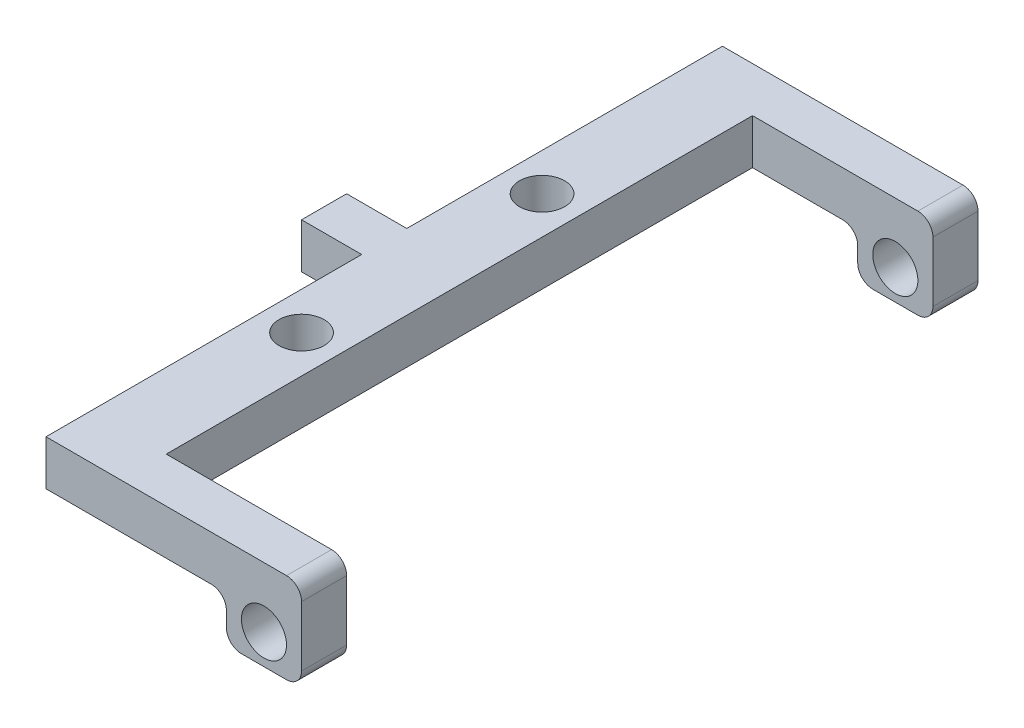
ISO-10303-21;
HEADER;
FILE_DESCRIPTION(('STEP AP214'),'2;1');
FILE_NAME('part.step','',(''),(''),'','','');
FILE_SCHEMA(('AUTOMOTIVE_DESIGN { 1 0 10303 214 1 1 1 1 }'));
ENDSEC;
DATA;
#1=APPLICATION_CONTEXT('core data for automotive mechanical design processes');
#2=APPLICATION_PROTOCOL_DEFINITION('international standard','automotive_design',2000,#1);
#3=PRODUCT_CONTEXT('',#1,'mechanical');
#4=PRODUCT('Part','Part','',(#3));
#5=PRODUCT_RELATED_PRODUCT_CATEGORY('part','',(#4));
#6=PRODUCT_DEFINITION_FORMATION('','',#4);
#7=PRODUCT_DEFINITION_CONTEXT('part definition',#1,'design');
#8=PRODUCT_DEFINITION('design','',#6,#7);
#9=PRODUCT_DEFINITION_SHAPE('','',#8);
#10=(LENGTH_UNIT() NAMED_UNIT(*) SI_UNIT(.MILLI.,.METRE.));
#11=(NAMED_UNIT(*) PLANE_ANGLE_UNIT() SI_UNIT($,.RADIAN.));
#12=(NAMED_UNIT(*) SI_UNIT($,.STERADIAN.) SOLID_ANGLE_UNIT());
#13=UNCERTAINTY_MEASURE_WITH_UNIT(LENGTH_MEASURE(1.E-05),#10,'distance_accuracy_value','');
#14=(GEOMETRIC_REPRESENTATION_CONTEXT(3) GLOBAL_UNCERTAINTY_ASSIGNED_CONTEXT((#13)) GLOBAL_UNIT_ASSIGNED_CONTEXT((#10,
#11,#12)) REPRESENTATION_CONTEXT('',''));
#15=CARTESIAN_POINT('',(0.,0.,0.));
#16=DIRECTION('',(0.,0.,1.));
#17=DIRECTION('',(1.,0.,0.));
#18=AXIS2_PLACEMENT_3D('',#15,#16,#17);
#19=CARTESIAN_POINT('',(0.,3.,0.));
#20=DIRECTION('',(0.,1.,0.));
#21=DIRECTION('',(0.,0.,1.));
#22=AXIS2_PLACEMENT_3D('',#19,#20,#21);
#23=PLANE('',#22);
#24=CARTESIAN_POINT('',(0.,3.,-8.));
#25=DIRECTION('',(0.,1.,0.));
#26=DIRECTION('',(0.,0.,1.));
#27=AXIS2_PLACEMENT_3D('',#24,#25,#26);
#28=CIRCLE('',#27,1.5);
#29=CARTESIAN_POINT('',(0.,3.,-6.5));
#30=VERTEX_POINT('',#29);
#31=EDGE_CURVE('E236',#30,#30,#28,.T.);
#32=ORIENTED_EDGE('',*,*,#31,.F.);
#33=EDGE_LOOP('',(#32));
#34=FACE_BOUND('',#33,.T.);
#35=DIRECTION('',(1.,0.,0.));
#36=VECTOR('',#35,1.);
#37=CARTESIAN_POINT('',(-2.5,3.,22.5));
#38=LINE('',#37,#36);
#39=CARTESIAN_POINT('',(-2.5,3.,22.5));
#40=VERTEX_POINT('',#39);
#41=CARTESIAN_POINT('',(13.5,3.,22.5));
#42=VERTEX_POINT('',#41);
#43=EDGE_CURVE('E292',#40,#42,#38,.T.);
#44=ORIENTED_EDGE('',*,*,#43,.T.);
#45=DIRECTION('',(0.,0.,1.));
#46=VECTOR('',#45,1.);
#47=CARTESIAN_POINT('',(13.5,3.,19.5));
#48=LINE('',#47,#46);
#49=CARTESIAN_POINT('',(13.5,3.,19.5));
#50=VERTEX_POINT('',#49);
#51=EDGE_CURVE('E334',#50,#42,#48,.T.);
#52=ORIENTED_EDGE('',*,*,#51,.F.);
#53=DIRECTION('',(1.,0.,0.));
#54=VECTOR('',#53,1.);
#55=CARTESIAN_POINT('',(2.5,3.,19.5));
#56=LINE('',#55,#54);
#57=CARTESIAN_POINT('',(2.5,3.,19.5));
#58=VERTEX_POINT('',#57);
#59=EDGE_CURVE('E382',#58,#50,#56,.T.);
#60=ORIENTED_EDGE('',*,*,#59,.F.);
#61=DIRECTION('',(0.,0.,-1.));
#62=VECTOR('',#61,1.);
#63=CARTESIAN_POINT('',(2.5,3.,-10.5));
#64=LINE('',#63,#62);
#65=CARTESIAN_POINT('',(2.5,3.,-19.5));
#66=VERTEX_POINT('',#65);
#67=EDGE_CURVE('E55',#58,#66,#64,.T.);
#68=ORIENTED_EDGE('',*,*,#67,.T.);
#69=DIRECTION('',(1.,0.,0.));
#70=VECTOR('',#69,1.);
#71=CARTESIAN_POINT('',(2.5,3.,-19.5));
#72=LINE('',#71,#70);
#73=CARTESIAN_POINT('',(13.5,3.,-19.5));
#74=VERTEX_POINT('',#73);
#75=EDGE_CURVE('E394',#66,#74,#72,.T.);
#76=ORIENTED_EDGE('',*,*,#75,.T.);
#77=DIRECTION('',(0.,0.,-1.));
#78=VECTOR('',#77,1.);
#79=CARTESIAN_POINT('',(13.5,3.,-19.5));
#80=LINE('',#79,#78);
#81=CARTESIAN_POINT('',(13.5,3.,-22.5));
#82=VERTEX_POINT('',#81);
#83=EDGE_CURVE('E428',#74,#82,#80,.T.);
#84=ORIENTED_EDGE('',*,*,#83,.T.);
#85=DIRECTION('',(-1.,0.,0.));
#86=VECTOR('',#85,1.);
#87=CARTESIAN_POINT('',(-2.5,3.,-22.5));
#88=LINE('',#87,#86);
#89=CARTESIAN_POINT('',(-2.5,3.,-22.5));
#90=VERTEX_POINT('',#89);
#91=EDGE_CURVE('E294',#82,#90,#88,.T.);
#92=ORIENTED_EDGE('',*,*,#91,.T.);
#93=DIRECTION('',(0.,0.,1.));
#94=VECTOR('',#93,1.);
#95=CARTESIAN_POINT('',(-2.5,3.,-10.5));
#96=LINE('',#95,#94);
#97=CARTESIAN_POINT('',(-2.5,3.,-1.50000000000001));
#98=VERTEX_POINT('',#97);
#99=EDGE_CURVE('E91',#90,#98,#96,.T.);
#100=ORIENTED_EDGE('',*,*,#99,.T.);
#101=DIRECTION('',(-1.,0.,0.));
#102=VECTOR('',#101,1.);
#103=CARTESIAN_POINT('',(-6.5,3.,-1.5));
#104=LINE('',#103,#102);
#105=CARTESIAN_POINT('',(-6.5,3.,-1.5));
#106=VERTEX_POINT('',#105);
#107=EDGE_CURVE('E325',#98,#106,#104,.T.);
#108=ORIENTED_EDGE('',*,*,#107,.T.);
#109=DIRECTION('',(0.,0.,1.));
#110=VECTOR('',#109,1.);
#111=CARTESIAN_POINT('',(-6.5,3.,-1.5));
#112=LINE('',#111,#110);
#113=CARTESIAN_POINT('',(-6.5,3.,1.5));
#114=VERTEX_POINT('',#113);
#115=EDGE_CURVE('E272',#106,#114,#112,.T.);
#116=ORIENTED_EDGE('',*,*,#115,.T.);
#117=DIRECTION('',(1.,0.,0.));
#118=VECTOR('',#117,1.);
#119=CARTESIAN_POINT('',(-6.5,3.,1.5));
#120=LINE('',#119,#118);
#121=CARTESIAN_POINT('',(-2.5,3.,1.5));
#122=VERTEX_POINT('',#121);
#123=EDGE_CURVE('E63',#114,#122,#120,.T.);
#124=ORIENTED_EDGE('',*,*,#123,.T.);
#125=DIRECTION('',(0.,0.,1.));
#126=VECTOR('',#125,1.);
#127=CARTESIAN_POINT('',(-2.5,3.,1.5));
#128=LINE('',#127,#126);
#129=EDGE_CURVE('E246',#122,#40,#128,.T.);
#130=ORIENTED_EDGE('',*,*,#129,.T.);
#131=EDGE_LOOP('',(#44,#52,#60,#68,#76,#84,#92,#100,#108,#116,#124,#130));
#132=FACE_BOUND('',#131,.T.);
#133=CARTESIAN_POINT('',(0.,3.,8.));
#134=DIRECTION('',(0.,1.,0.));
#135=DIRECTION('',(0.,0.,1.));
#136=AXIS2_PLACEMENT_3D('',#133,#134,#135);
#137=CIRCLE('',#136,1.5);
#138=CARTESIAN_POINT('',(0.,3.,9.5));
#139=VERTEX_POINT('',#138);
#140=EDGE_CURVE('E311',#139,#139,#137,.T.);
#141=ORIENTED_EDGE('',*,*,#140,.F.);
#142=EDGE_LOOP('',(#141));
#143=FACE_BOUND('',#142,.T.);
#144=ADVANCED_FACE('F39',(#34,#132,#143),#23,.T.);
#145=CARTESIAN_POINT('',(0.,0.,0.));
#146=DIRECTION('',(0.,1.,0.));
#147=DIRECTION('',(0.,0.,1.));
#148=AXIS2_PLACEMENT_3D('',#145,#146,#147);
#149=PLANE('',#148);
#150=DIRECTION('',(0.,0.,-1.));
#151=VECTOR('',#150,1.);
#152=CARTESIAN_POINT('',(2.5,0.,-10.5));
#153=LINE('',#152,#151);
#154=CARTESIAN_POINT('',(2.5,0.,19.5));
#155=VERTEX_POINT('',#154);
#156=CARTESIAN_POINT('',(2.5,0.,-19.5));
#157=VERTEX_POINT('',#156);
#158=EDGE_CURVE('E224',#155,#157,#153,.T.);
#159=ORIENTED_EDGE('',*,*,#158,.F.);
#160=DIRECTION('',(-1.,0.,0.));
#161=VECTOR('',#160,1.);
#162=CARTESIAN_POINT('',(8.5,0.,19.5));
#163=LINE('',#162,#161);
#164=CARTESIAN_POINT('',(8.5,0.,19.5));
#165=VERTEX_POINT('',#164);
#166=EDGE_CURVE('E209',#165,#155,#163,.T.);
#167=ORIENTED_EDGE('',*,*,#166,.F.);
#168=DIRECTION('',(0.,0.,1.));
#169=VECTOR('',#168,1.);
#170=CARTESIAN_POINT('',(8.5,0.,19.5));
#171=LINE('',#170,#169);
#172=CARTESIAN_POINT('',(8.5,0.,22.5));
#173=VERTEX_POINT('',#172);
#174=EDGE_CURVE('E379',#165,#173,#171,.T.);
#175=ORIENTED_EDGE('',*,*,#174,.T.);
#176=DIRECTION('',(1.,0.,0.));
#177=VECTOR('',#176,1.);
#178=CARTESIAN_POINT('',(-2.5,0.,22.5));
#179=LINE('',#178,#177);
#180=CARTESIAN_POINT('',(-2.5,0.,22.5));
#181=VERTEX_POINT('',#180);
#182=EDGE_CURVE('E278',#181,#173,#179,.T.);
#183=ORIENTED_EDGE('',*,*,#182,.F.);
#184=DIRECTION('',(0.,0.,1.));
#185=VECTOR('',#184,1.);
#186=CARTESIAN_POINT('',(-2.5,0.,1.5));
#187=LINE('',#186,#185);
#188=CARTESIAN_POINT('',(-2.5,0.,1.5));
#189=VERTEX_POINT('',#188);
#190=EDGE_CURVE('E256',#189,#181,#187,.T.);
#191=ORIENTED_EDGE('',*,*,#190,.F.);
#192=DIRECTION('',(1.,0.,0.));
#193=VECTOR('',#192,1.);
#194=CARTESIAN_POINT('',(-6.5,0.,1.5));
#195=LINE('',#194,#193);
#196=CARTESIAN_POINT('',(-6.5,0.,1.5));
#197=VERTEX_POINT('',#196);
#198=EDGE_CURVE('E84',#197,#189,#195,.T.);
#199=ORIENTED_EDGE('',*,*,#198,.F.);
#200=DIRECTION('',(0.,0.,1.));
#201=VECTOR('',#200,1.);
#202=CARTESIAN_POINT('',(-6.5,0.,-1.5));
#203=LINE('',#202,#201);
#204=CARTESIAN_POINT('',(-6.5,0.,-1.5));
#205=VERTEX_POINT('',#204);
#206=EDGE_CURVE('E251',#205,#197,#203,.T.);
#207=ORIENTED_EDGE('',*,*,#206,.F.);
#208=DIRECTION('',(-1.,0.,0.));
#209=VECTOR('',#208,1.);
#210=CARTESIAN_POINT('',(-6.5,0.,-1.5));
#211=LINE('',#210,#209);
#212=CARTESIAN_POINT('',(-2.5,0.,-1.50000000000001));
#213=VERTEX_POINT('',#212);
#214=EDGE_CURVE('E240',#213,#205,#211,.T.);
#215=ORIENTED_EDGE('',*,*,#214,.F.);
#216=DIRECTION('',(0.,0.,1.));
#217=VECTOR('',#216,1.);
#218=CARTESIAN_POINT('',(-2.5,0.,-10.5));
#219=LINE('',#218,#217);
#220=CARTESIAN_POINT('',(-2.5,0.,-22.5));
#221=VERTEX_POINT('',#220);
#222=EDGE_CURVE('E235',#221,#213,#219,.T.);
#223=ORIENTED_EDGE('',*,*,#222,.F.);
#224=DIRECTION('',(-1.,0.,0.));
#225=VECTOR('',#224,1.);
#226=CARTESIAN_POINT('',(-2.5,0.,-22.5));
#227=LINE('',#226,#225);
#228=CARTESIAN_POINT('',(8.5,0.,-22.5));
#229=VERTEX_POINT('',#228);
#230=EDGE_CURVE('E298',#229,#221,#227,.T.);
#231=ORIENTED_EDGE('',*,*,#230,.F.);
#232=DIRECTION('',(0.,0.,-1.));
#233=VECTOR('',#232,1.);
#234=CARTESIAN_POINT('',(8.5,0.,-19.5));
#235=LINE('',#234,#233);
#236=CARTESIAN_POINT('',(8.5,0.,-19.5));
#237=VERTEX_POINT('',#236);
#238=EDGE_CURVE('E337',#237,#229,#235,.T.);
#239=ORIENTED_EDGE('',*,*,#238,.F.);
#240=DIRECTION('',(-1.,0.,0.));
#241=VECTOR('',#240,1.);
#242=CARTESIAN_POINT('',(8.5,0.,-19.5));
#243=LINE('',#242,#241);
#244=EDGE_CURVE('E233',#237,#157,#243,.T.);
#245=ORIENTED_EDGE('',*,*,#244,.T.);
#246=EDGE_LOOP('',(#159,#167,#175,#183,#191,#199,#207,#215,#223,#231,#239,#245));
#247=FACE_BOUND('',#246,.T.);
#248=CARTESIAN_POINT('',(0.,0.,-8.));
#249=DIRECTION('',(0.,1.,0.));
#250=DIRECTION('',(0.,0.,1.));
#251=AXIS2_PLACEMENT_3D('',#248,#249,#250);
#252=CIRCLE('',#251,1.5);
#253=CARTESIAN_POINT('',(0.,0.,-6.5));
#254=VERTEX_POINT('',#253);
#255=EDGE_CURVE('E243',#254,#254,#252,.T.);
#256=ORIENTED_EDGE('',*,*,#255,.T.);
#257=EDGE_LOOP('',(#256));
#258=FACE_BOUND('',#257,.T.);
#259=CARTESIAN_POINT('',(0.,0.,8.));
#260=DIRECTION('',(0.,1.,0.));
#261=DIRECTION('',(0.,0.,1.));
#262=AXIS2_PLACEMENT_3D('',#259,#260,#261);
#263=CIRCLE('',#262,1.5);
#264=CARTESIAN_POINT('',(0.,0.,9.5));
#265=VERTEX_POINT('',#264);
#266=EDGE_CURVE('E310',#265,#265,#263,.T.);
#267=ORIENTED_EDGE('',*,*,#266,.T.);
#268=EDGE_LOOP('',(#267));
#269=FACE_BOUND('',#268,.T.);
#270=ADVANCED_FACE('F230',(#247,#258,#269),#149,.F.);
#271=CARTESIAN_POINT('',(2.5,3.,-10.5));
#272=DIRECTION('',(-1.,0.,0.));
#273=DIRECTION('',(0.,0.,1.));
#274=AXIS2_PLACEMENT_3D('',#271,#272,#273);
#275=PLANE('',#274);
#276=ORIENTED_EDGE('',*,*,#67,.F.);
#277=DIRECTION('',(0.,1.,0.));
#278=VECTOR('',#277,1.);
#279=CARTESIAN_POINT('',(2.5,3.,19.5));
#280=LINE('',#279,#278);
#281=EDGE_CURVE('E213',#155,#58,#280,.T.);
#282=ORIENTED_EDGE('',*,*,#281,.F.);
#283=ORIENTED_EDGE('',*,*,#158,.T.);
#284=DIRECTION('',(0.,1.,0.));
#285=VECTOR('',#284,1.);
#286=CARTESIAN_POINT('',(2.5,3.,-19.5));
#287=LINE('',#286,#285);
#288=EDGE_CURVE('E391',#157,#66,#287,.T.);
#289=ORIENTED_EDGE('',*,*,#288,.T.);
#290=EDGE_LOOP('',(#276,#282,#283,#289));
#291=FACE_BOUND('',#290,.T.);
#292=ADVANCED_FACE('F41',(#291),#275,.F.);
#293=CARTESIAN_POINT('',(-2.5,3.,-10.5));
#294=DIRECTION('',(1.,0.,0.));
#295=DIRECTION('',(0.,0.,-1.));
#296=AXIS2_PLACEMENT_3D('',#293,#294,#295);
#297=PLANE('',#296);
#298=ORIENTED_EDGE('',*,*,#222,.T.);
#299=DIRECTION('',(0.,-1.,0.));
#300=VECTOR('',#299,1.);
#301=CARTESIAN_POINT('',(-2.5,3.,-1.50000000000001));
#302=LINE('',#301,#300);
#303=EDGE_CURVE('E11',#98,#213,#302,.T.);
#304=ORIENTED_EDGE('',*,*,#303,.F.);
#305=ORIENTED_EDGE('',*,*,#99,.F.);
#306=DIRECTION('',(0.,1.,0.));
#307=VECTOR('',#306,1.);
#308=CARTESIAN_POINT('',(-2.5,0.,-22.5));
#309=LINE('',#308,#307);
#310=EDGE_CURVE('E305',#221,#90,#309,.T.);
#311=ORIENTED_EDGE('',*,*,#310,.F.);
#312=EDGE_LOOP('',(#298,#304,#305,#311));
#313=FACE_BOUND('',#312,.T.);
#314=ADVANCED_FACE('F488',(#313),#297,.F.);
#315=CARTESIAN_POINT('',(-6.5,3.,-1.5));
#316=DIRECTION('',(0.,0.,1.));
#317=DIRECTION('',(1.,0.,0.));
#318=AXIS2_PLACEMENT_3D('',#315,#316,#317);
#319=PLANE('',#318);
#320=ORIENTED_EDGE('',*,*,#214,.T.);
#321=DIRECTION('',(0.,-1.,0.));
#322=VECTOR('',#321,1.);
#323=CARTESIAN_POINT('',(-6.5,3.,-1.5));
#324=LINE('',#323,#322);
#325=EDGE_CURVE('E48',#106,#205,#324,.T.);
#326=ORIENTED_EDGE('',*,*,#325,.F.);
#327=ORIENTED_EDGE('',*,*,#107,.F.);
#328=ORIENTED_EDGE('',*,*,#303,.T.);
#329=EDGE_LOOP('',(#320,#326,#327,#328));
#330=FACE_BOUND('',#329,.T.);
#331=ADVANCED_FACE('F489',(#330),#319,.F.);
#332=CARTESIAN_POINT('',(-6.5,3.,-1.5));
#333=DIRECTION('',(1.,0.,0.));
#334=DIRECTION('',(0.,0.,-1.));
#335=AXIS2_PLACEMENT_3D('',#332,#333,#334);
#336=PLANE('',#335);
#337=ORIENTED_EDGE('',*,*,#206,.T.);
#338=DIRECTION('',(0.,-1.,0.));
#339=VECTOR('',#338,1.);
#340=CARTESIAN_POINT('',(-6.5,3.,1.5));
#341=LINE('',#340,#339);
#342=EDGE_CURVE('E262',#114,#197,#341,.T.);
#343=ORIENTED_EDGE('',*,*,#342,.F.);
#344=ORIENTED_EDGE('',*,*,#115,.F.);
#345=ORIENTED_EDGE('',*,*,#325,.T.);
#346=EDGE_LOOP('',(#337,#343,#344,#345));
#347=FACE_BOUND('',#346,.T.);
#348=ADVANCED_FACE('F270',(#347),#336,.F.);
#349=CARTESIAN_POINT('',(-6.5,3.,1.5));
#350=DIRECTION('',(0.,0.,-1.));
#351=DIRECTION('',(-1.,0.,0.));
#352=AXIS2_PLACEMENT_3D('',#349,#350,#351);
#353=PLANE('',#352);
#354=ORIENTED_EDGE('',*,*,#198,.T.);
#355=DIRECTION('',(0.,-1.,0.));
#356=VECTOR('',#355,1.);
#357=CARTESIAN_POINT('',(-2.5,3.,1.5));
#358=LINE('',#357,#356);
#359=EDGE_CURVE('E259',#122,#189,#358,.T.);
#360=ORIENTED_EDGE('',*,*,#359,.F.);
#361=ORIENTED_EDGE('',*,*,#123,.F.);
#362=ORIENTED_EDGE('',*,*,#342,.T.);
#363=EDGE_LOOP('',(#354,#360,#361,#362));
#364=FACE_BOUND('',#363,.T.);
#365=ADVANCED_FACE('F490',(#364),#353,.F.);
#366=CARTESIAN_POINT('',(-2.5,3.,1.5));
#367=DIRECTION('',(1.,0.,0.));
#368=DIRECTION('',(0.,0.,-1.));
#369=AXIS2_PLACEMENT_3D('',#366,#367,#368);
#370=PLANE('',#369);
#371=ORIENTED_EDGE('',*,*,#190,.T.);
#372=DIRECTION('',(0.,1.,0.));
#373=VECTOR('',#372,1.);
#374=CARTESIAN_POINT('',(-2.5,0.,22.5));
#375=LINE('',#374,#373);
#376=EDGE_CURVE('E284',#181,#40,#375,.T.);
#377=ORIENTED_EDGE('',*,*,#376,.T.);
#378=ORIENTED_EDGE('',*,*,#129,.F.);
#379=ORIENTED_EDGE('',*,*,#359,.T.);
#380=EDGE_LOOP('',(#371,#377,#378,#379));
#381=FACE_BOUND('',#380,.T.);
#382=ADVANCED_FACE('F282',(#381),#370,.F.);
#383=CARTESIAN_POINT('',(0.,3.,-8.));
#384=DIRECTION('',(0.,-1.,0.));
#385=DIRECTION('',(0.,0.,-1.));
#386=AXIS2_PLACEMENT_3D('',#383,#384,#385);
#387=CYLINDRICAL_SURFACE('',#386,1.5);
#388=ORIENTED_EDGE('',*,*,#31,.T.);
#389=EDGE_LOOP('',(#388));
#390=FACE_BOUND('',#389,.T.);
#391=ORIENTED_EDGE('',*,*,#255,.F.);
#392=EDGE_LOOP('',(#391));
#393=FACE_BOUND('',#392,.T.);
#394=ADVANCED_FACE('F497',(#390,#393),#387,.F.);
#395=CARTESIAN_POINT('',(0.,3.,8.));
#396=DIRECTION('',(0.,-1.,0.));
#397=DIRECTION('',(0.,0.,-1.));
#398=AXIS2_PLACEMENT_3D('',#395,#396,#397);
#399=CYLINDRICAL_SURFACE('',#398,1.5);
#400=ORIENTED_EDGE('',*,*,#140,.T.);
#401=EDGE_LOOP('',(#400));
#402=FACE_BOUND('',#401,.T.);
#403=ORIENTED_EDGE('',*,*,#266,.F.);
#404=EDGE_LOOP('',(#403));
#405=FACE_BOUND('',#404,.T.);
#406=ADVANCED_FACE('F511',(#402,#405),#399,.F.);
#407=CARTESIAN_POINT('',(-2.5,0.,-22.5));
#408=DIRECTION('',(0.,0.,-1.));
#409=DIRECTION('',(-1.,0.,0.));
#410=AXIS2_PLACEMENT_3D('',#407,#408,#409);
#411=PLANE('',#410);
#412=ORIENTED_EDGE('',*,*,#91,.F.);
#413=CARTESIAN_POINT('',(13.5,2.,-22.5));
#414=DIRECTION('',(0.,0.,-1.));
#415=DIRECTION('',(-1.,0.,0.));
#416=AXIS2_PLACEMENT_3D('',#413,#414,#415);
#417=CIRCLE('',#416,1.);
#418=CARTESIAN_POINT('',(14.5,2.,-22.5));
#419=VERTEX_POINT('',#418);
#420=EDGE_CURVE('E387',#82,#419,#417,.T.);
#421=ORIENTED_EDGE('',*,*,#420,.T.);
#422=DIRECTION('',(0.,-1.,0.));
#423=VECTOR('',#422,1.);
#424=CARTESIAN_POINT('',(14.5,2.,-22.5));
#425=LINE('',#424,#423);
#426=CARTESIAN_POINT('',(14.5,-2.,-22.5));
#427=VERTEX_POINT('',#426);
#428=EDGE_CURVE('E432',#419,#427,#425,.T.);
#429=ORIENTED_EDGE('',*,*,#428,.T.);
#430=CARTESIAN_POINT('',(13.5,-2.,-22.5));
#431=DIRECTION('',(0.,0.,-1.));
#432=DIRECTION('',(1.,0.,0.));
#433=AXIS2_PLACEMENT_3D('',#430,#431,#432);
#434=CIRCLE('',#433,1.);
#435=CARTESIAN_POINT('',(13.5,-3.,-22.5));
#436=VERTEX_POINT('',#435);
#437=EDGE_CURVE('E436',#427,#436,#434,.T.);
#438=ORIENTED_EDGE('',*,*,#437,.T.);
#439=DIRECTION('',(-1.,0.,0.));
#440=VECTOR('',#439,1.);
#441=CARTESIAN_POINT('',(13.5,-3.,-22.5));
#442=LINE('',#441,#440);
#443=CARTESIAN_POINT('',(10.5,-3.,-22.5));
#444=VERTEX_POINT('',#443);
#445=EDGE_CURVE('E440',#436,#444,#442,.T.);
#446=ORIENTED_EDGE('',*,*,#445,.T.);
#447=CARTESIAN_POINT('',(10.5,-2.,-22.5));
#448=DIRECTION('',(0.,0.,-1.));
#449=DIRECTION('',(-1.,0.,0.));
#450=AXIS2_PLACEMENT_3D('',#447,#448,#449);
#451=CIRCLE('',#450,1.);
#452=CARTESIAN_POINT('',(9.5,-2.,-22.5));
#453=VERTEX_POINT('',#452);
#454=EDGE_CURVE('E444',#444,#453,#451,.T.);
#455=ORIENTED_EDGE('',*,*,#454,.T.);
#456=DIRECTION('',(0.,1.,0.));
#457=VECTOR('',#456,1.);
#458=CARTESIAN_POINT('',(9.5,-2.,-22.5));
#459=LINE('',#458,#457);
#460=CARTESIAN_POINT('',(9.5,-1.,-22.5));
#461=VERTEX_POINT('',#460);
#462=EDGE_CURVE('E448',#453,#461,#459,.T.);
#463=ORIENTED_EDGE('',*,*,#462,.T.);
#464=CARTESIAN_POINT('',(8.5,-1.,-22.5));
#465=DIRECTION('',(0.,0.,1.));
#466=DIRECTION('',(1.,0.,0.));
#467=AXIS2_PLACEMENT_3D('',#464,#465,#466);
#468=CIRCLE('',#467,1.);
#469=EDGE_CURVE('E395',#461,#229,#468,.T.);
#470=ORIENTED_EDGE('',*,*,#469,.T.);
#471=ORIENTED_EDGE('',*,*,#230,.T.);
#472=ORIENTED_EDGE('',*,*,#310,.T.);
#473=EDGE_LOOP('',(#412,#421,#429,#438,#446,#455,#463,#470,#471,#472));
#474=FACE_BOUND('',#473,.T.);
#475=CARTESIAN_POINT('',(12.,-1.,-22.5));
#476=DIRECTION('',(0.,0.,-1.));
#477=DIRECTION('',(-1.,0.,0.));
#478=AXIS2_PLACEMENT_3D('',#475,#476,#477);
#479=CIRCLE('',#478,1.5);
#480=CARTESIAN_POINT('',(10.5,-1.,-22.5));
#481=VERTEX_POINT('',#480);
#482=EDGE_CURVE('E344',#481,#481,#479,.T.);
#483=ORIENTED_EDGE('',*,*,#482,.F.);
#484=EDGE_LOOP('',(#483));
#485=FACE_BOUND('',#484,.T.);
#486=ADVANCED_FACE('F484',(#474,#485),#411,.T.);
#487=CARTESIAN_POINT('',(-2.5,0.,22.5));
#488=DIRECTION('',(0.,0.,1.));
#489=DIRECTION('',(1.,0.,0.));
#490=AXIS2_PLACEMENT_3D('',#487,#488,#489);
#491=PLANE('',#490);
#492=ORIENTED_EDGE('',*,*,#43,.F.);
#493=ORIENTED_EDGE('',*,*,#376,.F.);
#494=ORIENTED_EDGE('',*,*,#182,.T.);
#495=CARTESIAN_POINT('',(8.5,-1.,22.5));
#496=DIRECTION('',(0.,0.,1.));
#497=DIRECTION('',(1.,0.,0.));
#498=AXIS2_PLACEMENT_3D('',#495,#496,#497);
#499=CIRCLE('',#498,1.);
#500=CARTESIAN_POINT('',(9.5,-1.,22.5));
#501=VERTEX_POINT('',#500);
#502=EDGE_CURVE('E597',#501,#173,#499,.T.);
#503=ORIENTED_EDGE('',*,*,#502,.F.);
#504=DIRECTION('',(0.,1.,0.));
#505=VECTOR('',#504,1.);
#506=CARTESIAN_POINT('',(9.5,-2.,22.5));
#507=LINE('',#506,#505);
#508=CARTESIAN_POINT('',(9.5,-2.,22.5));
#509=VERTEX_POINT('',#508);
#510=EDGE_CURVE('E623',#509,#501,#507,.T.);
#511=ORIENTED_EDGE('',*,*,#510,.F.);
#512=CARTESIAN_POINT('',(10.5,-2.,22.5));
#513=DIRECTION('',(0.,0.,-1.));
#514=DIRECTION('',(-1.,0.,0.));
#515=AXIS2_PLACEMENT_3D('',#512,#513,#514);
#516=CIRCLE('',#515,1.);
#517=CARTESIAN_POINT('',(10.5,-3.,22.5));
#518=VERTEX_POINT('',#517);
#519=EDGE_CURVE('E626',#518,#509,#516,.T.);
#520=ORIENTED_EDGE('',*,*,#519,.F.);
#521=DIRECTION('',(-1.,0.,0.));
#522=VECTOR('',#521,1.);
#523=CARTESIAN_POINT('',(13.5,-3.,22.5));
#524=LINE('',#523,#522);
#525=CARTESIAN_POINT('',(13.5,-3.,22.5));
#526=VERTEX_POINT('',#525);
#527=EDGE_CURVE('E629',#526,#518,#524,.T.);
#528=ORIENTED_EDGE('',*,*,#527,.F.);
#529=CARTESIAN_POINT('',(13.5,-2.,22.5));
#530=DIRECTION('',(0.,0.,-1.));
#531=DIRECTION('',(1.,0.,0.));
#532=AXIS2_PLACEMENT_3D('',#529,#530,#531);
#533=CIRCLE('',#532,1.);
#534=CARTESIAN_POINT('',(14.5,-2.,22.5));
#535=VERTEX_POINT('',#534);
#536=EDGE_CURVE('E353',#535,#526,#533,.T.);
#537=ORIENTED_EDGE('',*,*,#536,.F.);
#538=DIRECTION('',(0.,-1.,0.));
#539=VECTOR('',#538,1.);
#540=CARTESIAN_POINT('',(14.5,2.,22.5));
#541=LINE('',#540,#539);
#542=CARTESIAN_POINT('',(14.5,2.,22.5));
#543=VERTEX_POINT('',#542);
#544=EDGE_CURVE('E349',#543,#535,#541,.T.);
#545=ORIENTED_EDGE('',*,*,#544,.F.);
#546=CARTESIAN_POINT('',(13.5,2.,22.5));
#547=DIRECTION('',(0.,0.,-1.));
#548=DIRECTION('',(-1.,0.,0.));
#549=AXIS2_PLACEMENT_3D('',#546,#547,#548);
#550=CIRCLE('',#549,1.);
#551=EDGE_CURVE('E227',#42,#543,#550,.T.);
#552=ORIENTED_EDGE('',*,*,#551,.F.);
#553=EDGE_LOOP('',(#492,#493,#494,#503,#511,#520,#528,#537,#545,#552));
#554=FACE_BOUND('',#553,.T.);
#555=CARTESIAN_POINT('',(12.,-1.,22.5));
#556=DIRECTION('',(0.,0.,-1.));
#557=DIRECTION('',(-1.,0.,0.));
#558=AXIS2_PLACEMENT_3D('',#555,#556,#557);
#559=CIRCLE('',#558,1.5);
#560=CARTESIAN_POINT('',(10.5,-1.,22.5));
#561=VERTEX_POINT('',#560);
#562=EDGE_CURVE('E593',#561,#561,#559,.T.);
#563=ORIENTED_EDGE('',*,*,#562,.T.);
#564=EDGE_LOOP('',(#563));
#565=FACE_BOUND('',#564,.T.);
#566=ADVANCED_FACE('F287',(#554,#565),#491,.T.);
#567=CARTESIAN_POINT('',(8.5,-1.,-19.5));
#568=DIRECTION('',(0.,0.,-1.));
#569=DIRECTION('',(-1.,0.,0.));
#570=AXIS2_PLACEMENT_3D('',#567,#568,#569);
#571=CYLINDRICAL_SURFACE('',#570,1.);
#572=ORIENTED_EDGE('',*,*,#469,.F.);
#573=DIRECTION('',(0.,0.,-1.));
#574=VECTOR('',#573,1.);
#575=CARTESIAN_POINT('',(9.5,-1.,-19.5));
#576=LINE('',#575,#574);
#577=CARTESIAN_POINT('',(9.5,-1.,-19.5));
#578=VERTEX_POINT('',#577);
#579=EDGE_CURVE('E458',#578,#461,#576,.T.);
#580=ORIENTED_EDGE('',*,*,#579,.F.);
#581=CARTESIAN_POINT('',(8.5,-1.,-19.5));
#582=DIRECTION('',(0.,0.,1.));
#583=DIRECTION('',(1.,0.,0.));
#584=AXIS2_PLACEMENT_3D('',#581,#582,#583);
#585=CIRCLE('',#584,1.);
#586=EDGE_CURVE('E422',#578,#237,#585,.T.);
#587=ORIENTED_EDGE('',*,*,#586,.T.);
#588=ORIENTED_EDGE('',*,*,#238,.T.);
#589=EDGE_LOOP('',(#572,#580,#587,#588));
#590=FACE_BOUND('',#589,.T.);
#591=ADVANCED_FACE('F520',(#590),#571,.F.);
#592=CARTESIAN_POINT('',(9.5,-2.,-19.5));
#593=DIRECTION('',(-1.,0.,0.));
#594=DIRECTION('',(0.,0.,1.));
#595=AXIS2_PLACEMENT_3D('',#592,#593,#594);
#596=PLANE('',#595);
#597=ORIENTED_EDGE('',*,*,#462,.F.);
#598=DIRECTION('',(0.,0.,-1.));
#599=VECTOR('',#598,1.);
#600=CARTESIAN_POINT('',(9.5,-2.,-19.5));
#601=LINE('',#600,#599);
#602=CARTESIAN_POINT('',(9.5,-2.,-19.5));
#603=VERTEX_POINT('',#602);
#604=EDGE_CURVE('E461',#603,#453,#601,.T.);
#605=ORIENTED_EDGE('',*,*,#604,.F.);
#606=DIRECTION('',(0.,1.,0.));
#607=VECTOR('',#606,1.);
#608=CARTESIAN_POINT('',(9.5,-2.,-19.5));
#609=LINE('',#608,#607);
#610=EDGE_CURVE('E418',#603,#578,#609,.T.);
#611=ORIENTED_EDGE('',*,*,#610,.T.);
#612=ORIENTED_EDGE('',*,*,#579,.T.);
#613=EDGE_LOOP('',(#597,#605,#611,#612));
#614=FACE_BOUND('',#613,.T.);
#615=ADVANCED_FACE('F539',(#614),#596,.T.);
#616=CARTESIAN_POINT('',(10.5,-2.,-19.5));
#617=DIRECTION('',(0.,0.,-1.));
#618=DIRECTION('',(-1.,0.,0.));
#619=AXIS2_PLACEMENT_3D('',#616,#617,#618);
#620=CYLINDRICAL_SURFACE('',#619,1.);
#621=ORIENTED_EDGE('',*,*,#454,.F.);
#622=DIRECTION('',(0.,0.,-1.));
#623=VECTOR('',#622,1.);
#624=CARTESIAN_POINT('',(10.5,-3.,-19.5));
#625=LINE('',#624,#623);
#626=CARTESIAN_POINT('',(10.5,-3.,-19.5));
#627=VERTEX_POINT('',#626);
#628=EDGE_CURVE('E464',#627,#444,#625,.T.);
#629=ORIENTED_EDGE('',*,*,#628,.F.);
#630=CARTESIAN_POINT('',(10.5,-2.,-19.5));
#631=DIRECTION('',(0.,0.,-1.));
#632=DIRECTION('',(-1.,0.,0.));
#633=AXIS2_PLACEMENT_3D('',#630,#631,#632);
#634=CIRCLE('',#633,1.);
#635=EDGE_CURVE('E414',#627,#603,#634,.T.);
#636=ORIENTED_EDGE('',*,*,#635,.T.);
#637=ORIENTED_EDGE('',*,*,#604,.T.);
#638=EDGE_LOOP('',(#621,#629,#636,#637));
#639=FACE_BOUND('',#638,.T.);
#640=ADVANCED_FACE('F535',(#639),#620,.T.);
#641=CARTESIAN_POINT('',(13.5,-3.,-19.5));
#642=DIRECTION('',(0.,-1.,0.));
#643=DIRECTION('',(0.,0.,-1.));
#644=AXIS2_PLACEMENT_3D('',#641,#642,#643);
#645=PLANE('',#644);
#646=ORIENTED_EDGE('',*,*,#445,.F.);
#647=DIRECTION('',(0.,0.,-1.));
#648=VECTOR('',#647,1.);
#649=CARTESIAN_POINT('',(13.5,-3.,-19.5));
#650=LINE('',#649,#648);
#651=CARTESIAN_POINT('',(13.5,-3.,-19.5));
#652=VERTEX_POINT('',#651);
#653=EDGE_CURVE('E467',#652,#436,#650,.T.);
#654=ORIENTED_EDGE('',*,*,#653,.F.);
#655=DIRECTION('',(-1.,0.,0.));
#656=VECTOR('',#655,1.);
#657=CARTESIAN_POINT('',(13.5,-3.,-19.5));
#658=LINE('',#657,#656);
#659=EDGE_CURVE('E410',#652,#627,#658,.T.);
#660=ORIENTED_EDGE('',*,*,#659,.T.);
#661=ORIENTED_EDGE('',*,*,#628,.T.);
#662=EDGE_LOOP('',(#646,#654,#660,#661));
#663=FACE_BOUND('',#662,.T.);
#664=ADVANCED_FACE('F531',(#663),#645,.T.);
#665=CARTESIAN_POINT('',(13.5,-2.,-19.5));
#666=DIRECTION('',(0.,0.,-1.));
#667=DIRECTION('',(-1.,0.,0.));
#668=AXIS2_PLACEMENT_3D('',#665,#666,#667);
#669=CYLINDRICAL_SURFACE('',#668,1.);
#670=ORIENTED_EDGE('',*,*,#437,.F.);
#671=DIRECTION('',(0.,0.,-1.));
#672=VECTOR('',#671,1.);
#673=CARTESIAN_POINT('',(14.5,-2.,-19.5));
#674=LINE('',#673,#672);
#675=CARTESIAN_POINT('',(14.5,-2.,-19.5));
#676=VERTEX_POINT('',#675);
#677=EDGE_CURVE('E470',#676,#427,#674,.T.);
#678=ORIENTED_EDGE('',*,*,#677,.F.);
#679=CARTESIAN_POINT('',(13.5,-2.,-19.5));
#680=DIRECTION('',(0.,0.,-1.));
#681=DIRECTION('',(1.,0.,0.));
#682=AXIS2_PLACEMENT_3D('',#679,#680,#681);
#683=CIRCLE('',#682,1.);
#684=EDGE_CURVE('E406',#676,#652,#683,.T.);
#685=ORIENTED_EDGE('',*,*,#684,.T.);
#686=ORIENTED_EDGE('',*,*,#653,.T.);
#687=EDGE_LOOP('',(#670,#678,#685,#686));
#688=FACE_BOUND('',#687,.T.);
#689=ADVANCED_FACE('F527',(#688),#669,.T.);
#690=CARTESIAN_POINT('',(14.5,2.,-19.5));
#691=DIRECTION('',(1.,0.,0.));
#692=DIRECTION('',(0.,0.,-1.));
#693=AXIS2_PLACEMENT_3D('',#690,#691,#692);
#694=PLANE('',#693);
#695=ORIENTED_EDGE('',*,*,#428,.F.);
#696=DIRECTION('',(0.,0.,-1.));
#697=VECTOR('',#696,1.);
#698=CARTESIAN_POINT('',(14.5,2.,-19.5));
#699=LINE('',#698,#697);
#700=CARTESIAN_POINT('',(14.5,2.,-19.5));
#701=VERTEX_POINT('',#700);
#702=EDGE_CURVE('E473',#701,#419,#699,.T.);
#703=ORIENTED_EDGE('',*,*,#702,.F.);
#704=DIRECTION('',(0.,-1.,0.));
#705=VECTOR('',#704,1.);
#706=CARTESIAN_POINT('',(14.5,2.,-19.5));
#707=LINE('',#706,#705);
#708=EDGE_CURVE('E402',#701,#676,#707,.T.);
#709=ORIENTED_EDGE('',*,*,#708,.T.);
#710=ORIENTED_EDGE('',*,*,#677,.T.);
#711=EDGE_LOOP('',(#695,#703,#709,#710));
#712=FACE_BOUND('',#711,.T.);
#713=ADVANCED_FACE('F524',(#712),#694,.T.);
#714=CARTESIAN_POINT('',(13.5,2.,-19.5));
#715=DIRECTION('',(0.,0.,-1.));
#716=DIRECTION('',(-1.,0.,0.));
#717=AXIS2_PLACEMENT_3D('',#714,#715,#716);
#718=CYLINDRICAL_SURFACE('',#717,1.);
#719=ORIENTED_EDGE('',*,*,#420,.F.);
#720=ORIENTED_EDGE('',*,*,#83,.F.);
#721=CARTESIAN_POINT('',(13.5,2.,-19.5));
#722=DIRECTION('',(0.,0.,-1.));
#723=DIRECTION('',(-1.,0.,0.));
#724=AXIS2_PLACEMENT_3D('',#721,#722,#723);
#725=CIRCLE('',#724,1.);
#726=EDGE_CURVE('E398',#74,#701,#725,.T.);
#727=ORIENTED_EDGE('',*,*,#726,.T.);
#728=ORIENTED_EDGE('',*,*,#702,.T.);
#729=EDGE_LOOP('',(#719,#720,#727,#728));
#730=FACE_BOUND('',#729,.T.);
#731=ADVANCED_FACE('F481',(#730),#718,.T.);
#732=CARTESIAN_POINT('',(8.5,-1.,-19.5));
#733=DIRECTION('',(0.,0.,1.));
#734=DIRECTION('',(1.,0.,0.));
#735=AXIS2_PLACEMENT_3D('',#732,#733,#734);
#736=PLANE('',#735);
#737=CARTESIAN_POINT('',(12.,-1.,-19.5));
#738=DIRECTION('',(0.,0.,-1.));
#739=DIRECTION('',(-1.,0.,0.));
#740=AXIS2_PLACEMENT_3D('',#737,#738,#739);
#741=CIRCLE('',#740,1.5);
#742=CARTESIAN_POINT('',(10.5,-1.,-19.5));
#743=VERTEX_POINT('',#742);
#744=EDGE_CURVE('E383',#743,#743,#741,.T.);
#745=ORIENTED_EDGE('',*,*,#744,.T.);
#746=EDGE_LOOP('',(#745));
#747=FACE_BOUND('',#746,.T.);
#748=ORIENTED_EDGE('',*,*,#288,.F.);
#749=ORIENTED_EDGE('',*,*,#244,.F.);
#750=ORIENTED_EDGE('',*,*,#586,.F.);
#751=ORIENTED_EDGE('',*,*,#610,.F.);
#752=ORIENTED_EDGE('',*,*,#635,.F.);
#753=ORIENTED_EDGE('',*,*,#659,.F.);
#754=ORIENTED_EDGE('',*,*,#684,.F.);
#755=ORIENTED_EDGE('',*,*,#708,.F.);
#756=ORIENTED_EDGE('',*,*,#726,.F.);
#757=ORIENTED_EDGE('',*,*,#75,.F.);
#758=EDGE_LOOP('',(#748,#749,#750,#751,#752,#753,#754,#755,#756,#757));
#759=FACE_BOUND('',#758,.T.);
#760=ADVANCED_FACE('F523',(#747,#759),#736,.T.);
#761=CARTESIAN_POINT('',(12.,-1.,-19.5));
#762=DIRECTION('',(0.,0.,-1.));
#763=DIRECTION('',(-1.,0.,0.));
#764=AXIS2_PLACEMENT_3D('',#761,#762,#763);
#765=CYLINDRICAL_SURFACE('',#764,1.5);
#766=ORIENTED_EDGE('',*,*,#744,.F.);
#767=EDGE_LOOP('',(#766));
#768=FACE_BOUND('',#767,.T.);
#769=ORIENTED_EDGE('',*,*,#482,.T.);
#770=EDGE_LOOP('',(#769));
#771=FACE_BOUND('',#770,.T.);
#772=ADVANCED_FACE('F549',(#768,#771),#765,.F.);
#773=CARTESIAN_POINT('',(8.5,-1.,19.5));
#774=DIRECTION('',(0.,0.,-1.));
#775=DIRECTION('',(1.,0.,0.));
#776=AXIS2_PLACEMENT_3D('',#773,#774,#775);
#777=PLANE('',#776);
#778=ORIENTED_EDGE('',*,*,#281,.T.);
#779=ORIENTED_EDGE('',*,*,#59,.T.);
#780=CARTESIAN_POINT('',(13.5,2.,19.5));
#781=DIRECTION('',(0.,0.,-1.));
#782=DIRECTION('',(-1.,0.,0.));
#783=AXIS2_PLACEMENT_3D('',#780,#781,#782);
#784=CIRCLE('',#783,1.);
#785=CARTESIAN_POINT('',(14.5,2.,19.5));
#786=VERTEX_POINT('',#785);
#787=EDGE_CURVE('E342',#50,#786,#784,.T.);
#788=ORIENTED_EDGE('',*,*,#787,.T.);
#789=DIRECTION('',(0.,-1.,0.));
#790=VECTOR('',#789,1.);
#791=CARTESIAN_POINT('',(14.5,2.,19.5));
#792=LINE('',#791,#790);
#793=CARTESIAN_POINT('',(14.5,-2.,19.5));
#794=VERTEX_POINT('',#793);
#795=EDGE_CURVE('E614',#786,#794,#792,.T.);
#796=ORIENTED_EDGE('',*,*,#795,.T.);
#797=CARTESIAN_POINT('',(13.5,-2.,19.5));
#798=DIRECTION('',(0.,0.,-1.));
#799=DIRECTION('',(1.,0.,0.));
#800=AXIS2_PLACEMENT_3D('',#797,#798,#799);
#801=CIRCLE('',#800,1.);
#802=CARTESIAN_POINT('',(13.5,-3.,19.5));
#803=VERTEX_POINT('',#802);
#804=EDGE_CURVE('E611',#794,#803,#801,.T.);
#805=ORIENTED_EDGE('',*,*,#804,.T.);
#806=DIRECTION('',(-1.,0.,0.));
#807=VECTOR('',#806,1.);
#808=CARTESIAN_POINT('',(13.5,-3.,19.5));
#809=LINE('',#808,#807);
#810=CARTESIAN_POINT('',(10.5,-3.,19.5));
#811=VERTEX_POINT('',#810);
#812=EDGE_CURVE('E608',#803,#811,#809,.T.);
#813=ORIENTED_EDGE('',*,*,#812,.T.);
#814=CARTESIAN_POINT('',(10.5,-2.,19.5));
#815=DIRECTION('',(0.,0.,-1.));
#816=DIRECTION('',(-1.,0.,0.));
#817=AXIS2_PLACEMENT_3D('',#814,#815,#816);
#818=CIRCLE('',#817,1.);
#819=CARTESIAN_POINT('',(9.5,-2.,19.5));
#820=VERTEX_POINT('',#819);
#821=EDGE_CURVE('E605',#811,#820,#818,.T.);
#822=ORIENTED_EDGE('',*,*,#821,.T.);
#823=DIRECTION('',(0.,1.,0.));
#824=VECTOR('',#823,1.);
#825=CARTESIAN_POINT('',(9.5,-2.,19.5));
#826=LINE('',#825,#824);
#827=CARTESIAN_POINT('',(9.5,-1.,19.5));
#828=VERTEX_POINT('',#827);
#829=EDGE_CURVE('E602',#820,#828,#826,.T.);
#830=ORIENTED_EDGE('',*,*,#829,.T.);
#831=CARTESIAN_POINT('',(8.5,-1.,19.5));
#832=DIRECTION('',(0.,0.,1.));
#833=DIRECTION('',(1.,0.,0.));
#834=AXIS2_PLACEMENT_3D('',#831,#832,#833);
#835=CIRCLE('',#834,1.);
#836=EDGE_CURVE('E215',#828,#165,#835,.T.);
#837=ORIENTED_EDGE('',*,*,#836,.T.);
#838=ORIENTED_EDGE('',*,*,#166,.T.);
#839=EDGE_LOOP('',(#778,#779,#788,#796,#805,#813,#822,#830,#837,#838));
#840=FACE_BOUND('',#839,.T.);
#841=CARTESIAN_POINT('',(12.,-1.,19.5));
#842=DIRECTION('',(0.,0.,-1.));
#843=DIRECTION('',(-1.,0.,0.));
#844=AXIS2_PLACEMENT_3D('',#841,#842,#843);
#845=CIRCLE('',#844,1.5);
#846=CARTESIAN_POINT('',(10.5,-1.,19.5));
#847=VERTEX_POINT('',#846);
#848=EDGE_CURVE('E590',#847,#847,#845,.T.);
#849=ORIENTED_EDGE('',*,*,#848,.F.);
#850=EDGE_LOOP('',(#849));
#851=FACE_BOUND('',#850,.T.);
#852=ADVANCED_FACE('F211',(#840,#851),#777,.T.);
#853=CARTESIAN_POINT('',(13.5,2.,19.5));
#854=DIRECTION('',(0.,0.,1.));
#855=DIRECTION('',(1.,0.,0.));
#856=AXIS2_PLACEMENT_3D('',#853,#854,#855);
#857=CYLINDRICAL_SURFACE('',#856,1.);
#858=ORIENTED_EDGE('',*,*,#551,.T.);
#859=DIRECTION('',(0.,0.,1.));
#860=VECTOR('',#859,1.);
#861=CARTESIAN_POINT('',(14.5,2.,19.5));
#862=LINE('',#861,#860);
#863=EDGE_CURVE('E345',#786,#543,#862,.T.);
#864=ORIENTED_EDGE('',*,*,#863,.F.);
#865=ORIENTED_EDGE('',*,*,#787,.F.);
#866=ORIENTED_EDGE('',*,*,#51,.T.);
#867=EDGE_LOOP('',(#858,#864,#865,#866));
#868=FACE_BOUND('',#867,.T.);
#869=ADVANCED_FACE('F339',(#868),#857,.T.);
#870=CARTESIAN_POINT('',(14.5,2.,19.5));
#871=DIRECTION('',(-1.,0.,0.));
#872=DIRECTION('',(0.,0.,1.));
#873=AXIS2_PLACEMENT_3D('',#870,#871,#872);
#874=PLANE('',#873);
#875=ORIENTED_EDGE('',*,*,#544,.T.);
#876=DIRECTION('',(0.,0.,1.));
#877=VECTOR('',#876,1.);
#878=CARTESIAN_POINT('',(14.5,-2.,19.5));
#879=LINE('',#878,#877);
#880=EDGE_CURVE('E359',#794,#535,#879,.T.);
#881=ORIENTED_EDGE('',*,*,#880,.F.);
#882=ORIENTED_EDGE('',*,*,#795,.F.);
#883=ORIENTED_EDGE('',*,*,#863,.T.);
#884=EDGE_LOOP('',(#875,#881,#882,#883));
#885=FACE_BOUND('',#884,.T.);
#886=ADVANCED_FACE('F574',(#885),#874,.F.);
#887=CARTESIAN_POINT('',(13.5,-2.,19.5));
#888=DIRECTION('',(0.,0.,1.));
#889=DIRECTION('',(1.,0.,0.));
#890=AXIS2_PLACEMENT_3D('',#887,#888,#889);
#891=CYLINDRICAL_SURFACE('',#890,1.);
#892=ORIENTED_EDGE('',*,*,#536,.T.);
#893=DIRECTION('',(0.,0.,1.));
#894=VECTOR('',#893,1.);
#895=CARTESIAN_POINT('',(13.5,-3.,19.5));
#896=LINE('',#895,#894);
#897=EDGE_CURVE('E363',#803,#526,#896,.T.);
#898=ORIENTED_EDGE('',*,*,#897,.F.);
#899=ORIENTED_EDGE('',*,*,#804,.F.);
#900=ORIENTED_EDGE('',*,*,#880,.T.);
#901=EDGE_LOOP('',(#892,#898,#899,#900));
#902=FACE_BOUND('',#901,.T.);
#903=ADVANCED_FACE('F570',(#902),#891,.T.);
#904=CARTESIAN_POINT('',(13.5,-3.,19.5));
#905=DIRECTION('',(0.,1.,0.));
#906=DIRECTION('',(0.,0.,1.));
#907=AXIS2_PLACEMENT_3D('',#904,#905,#906);
#908=PLANE('',#907);
#909=ORIENTED_EDGE('',*,*,#527,.T.);
#910=DIRECTION('',(0.,0.,1.));
#911=VECTOR('',#910,1.);
#912=CARTESIAN_POINT('',(10.5,-3.,19.5));
#913=LINE('',#912,#911);
#914=EDGE_CURVE('E367',#811,#518,#913,.T.);
#915=ORIENTED_EDGE('',*,*,#914,.F.);
#916=ORIENTED_EDGE('',*,*,#812,.F.);
#917=ORIENTED_EDGE('',*,*,#897,.T.);
#918=EDGE_LOOP('',(#909,#915,#916,#917));
#919=FACE_BOUND('',#918,.T.);
#920=ADVANCED_FACE('F566',(#919),#908,.F.);
#921=CARTESIAN_POINT('',(10.5,-2.,19.5));
#922=DIRECTION('',(0.,0.,1.));
#923=DIRECTION('',(1.,0.,0.));
#924=AXIS2_PLACEMENT_3D('',#921,#922,#923);
#925=CYLINDRICAL_SURFACE('',#924,1.);
#926=ORIENTED_EDGE('',*,*,#519,.T.);
#927=DIRECTION('',(0.,0.,1.));
#928=VECTOR('',#927,1.);
#929=CARTESIAN_POINT('',(9.5,-2.,19.5));
#930=LINE('',#929,#928);
#931=EDGE_CURVE('E371',#820,#509,#930,.T.);
#932=ORIENTED_EDGE('',*,*,#931,.F.);
#933=ORIENTED_EDGE('',*,*,#821,.F.);
#934=ORIENTED_EDGE('',*,*,#914,.T.);
#935=EDGE_LOOP('',(#926,#932,#933,#934));
#936=FACE_BOUND('',#935,.T.);
#937=ADVANCED_FACE('F562',(#936),#925,.T.);
#938=CARTESIAN_POINT('',(9.5,-2.,19.5));
#939=DIRECTION('',(1.,0.,0.));
#940=DIRECTION('',(0.,0.,-1.));
#941=AXIS2_PLACEMENT_3D('',#938,#939,#940);
#942=PLANE('',#941);
#943=ORIENTED_EDGE('',*,*,#510,.T.);
#944=DIRECTION('',(0.,0.,1.));
#945=VECTOR('',#944,1.);
#946=CARTESIAN_POINT('',(9.5,-1.,19.5));
#947=LINE('',#946,#945);
#948=EDGE_CURVE('E375',#828,#501,#947,.T.);
#949=ORIENTED_EDGE('',*,*,#948,.F.);
#950=ORIENTED_EDGE('',*,*,#829,.F.);
#951=ORIENTED_EDGE('',*,*,#931,.T.);
#952=EDGE_LOOP('',(#943,#949,#950,#951));
#953=FACE_BOUND('',#952,.T.);
#954=ADVANCED_FACE('F558',(#953),#942,.F.);
#955=CARTESIAN_POINT('',(8.5,-1.,19.5));
#956=DIRECTION('',(0.,0.,1.));
#957=DIRECTION('',(1.,0.,0.));
#958=AXIS2_PLACEMENT_3D('',#955,#956,#957);
#959=CYLINDRICAL_SURFACE('',#958,1.);
#960=ORIENTED_EDGE('',*,*,#502,.T.);
#961=ORIENTED_EDGE('',*,*,#174,.F.);
#962=ORIENTED_EDGE('',*,*,#836,.F.);
#963=ORIENTED_EDGE('',*,*,#948,.T.);
#964=EDGE_LOOP('',(#960,#961,#962,#963));
#965=FACE_BOUND('',#964,.T.);
#966=ADVANCED_FACE('F554',(#965),#959,.F.);
#967=CARTESIAN_POINT('',(12.,-1.,19.5));
#968=DIRECTION('',(0.,0.,1.));
#969=DIRECTION('',(1.,0.,0.));
#970=AXIS2_PLACEMENT_3D('',#967,#968,#969);
#971=CYLINDRICAL_SURFACE('',#970,1.5);
#972=ORIENTED_EDGE('',*,*,#848,.T.);
#973=EDGE_LOOP('',(#972));
#974=FACE_BOUND('',#973,.T.);
#975=ORIENTED_EDGE('',*,*,#562,.F.);
#976=EDGE_LOOP('',(#975));
#977=FACE_BOUND('',#976,.T.);
#978=ADVANCED_FACE('F557',(#974,#977),#971,.F.);
#979=CLOSED_SHELL('',(#144,#270,#292,#314,#331,#348,#365,#382,#394,#406,#486,#566,#591,#615,
#640,#664,#689,#713,#731,#760,#772,#852,#869,#886,#903,#920,#937,#954,#966,#978));
#980=MANIFOLD_SOLID_BREP('B2',#979);
#981=ADVANCED_BREP_SHAPE_REPRESENTATION('',(#18,#980),#14);
#982=SHAPE_DEFINITION_REPRESENTATION(#9,#981);
ENDSEC;
END-ISO-10303-21;
